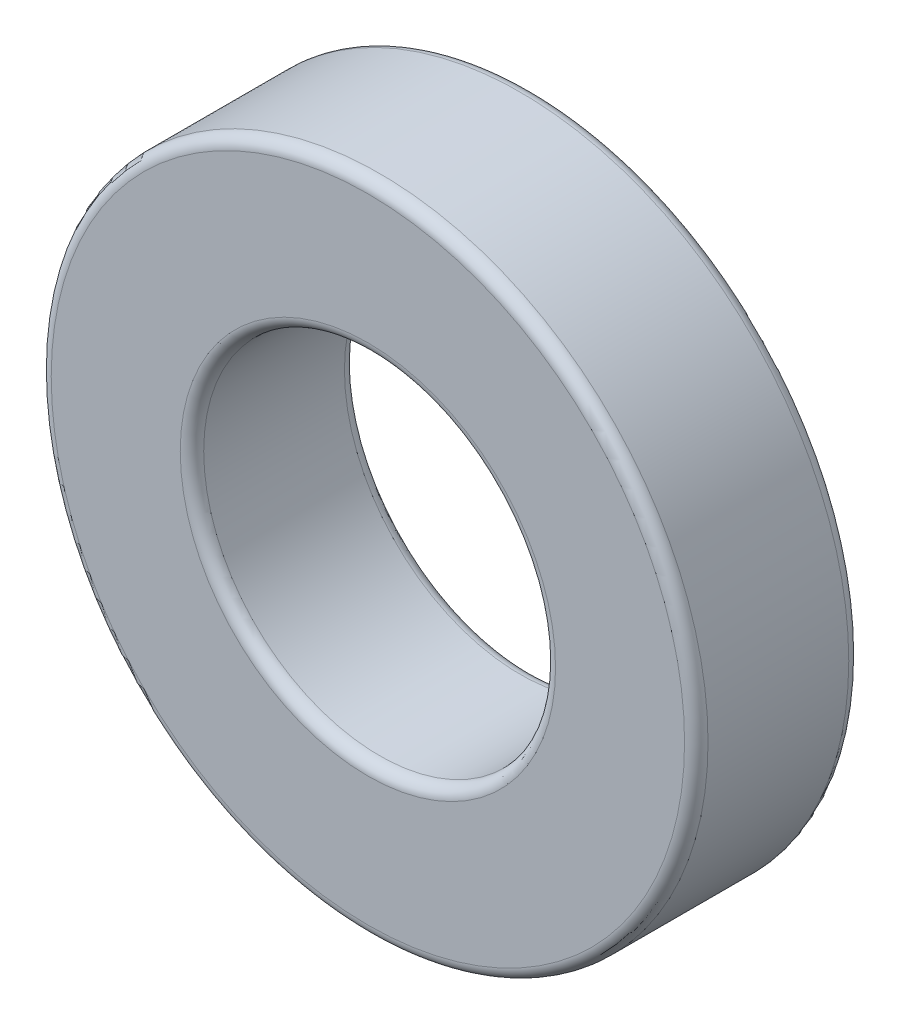
ISO-10303-21;
HEADER;
FILE_DESCRIPTION(('STEP AP214'),'2;1');
FILE_NAME('part.step','',(''),(''),'','','');
FILE_SCHEMA(('AUTOMOTIVE_DESIGN { 1 0 10303 214 1 1 1 1 }'));
ENDSEC;
DATA;
#1=APPLICATION_CONTEXT('core data for automotive mechanical design processes');
#2=APPLICATION_PROTOCOL_DEFINITION('international standard','automotive_design',2000,#1);
#3=PRODUCT_CONTEXT('',#1,'mechanical');
#4=PRODUCT('Part','Part','',(#3));
#5=PRODUCT_RELATED_PRODUCT_CATEGORY('part','',(#4));
#6=PRODUCT_DEFINITION_FORMATION('','',#4);
#7=PRODUCT_DEFINITION_CONTEXT('part definition',#1,'design');
#8=PRODUCT_DEFINITION('design','',#6,#7);
#9=PRODUCT_DEFINITION_SHAPE('','',#8);
#10=(LENGTH_UNIT() NAMED_UNIT(*) SI_UNIT(.MILLI.,.METRE.));
#11=(NAMED_UNIT(*) PLANE_ANGLE_UNIT() SI_UNIT($,.RADIAN.));
#12=(NAMED_UNIT(*) SI_UNIT($,.STERADIAN.) SOLID_ANGLE_UNIT());
#13=UNCERTAINTY_MEASURE_WITH_UNIT(LENGTH_MEASURE(1.E-05),#10,'distance_accuracy_value','');
#14=(GEOMETRIC_REPRESENTATION_CONTEXT(3) GLOBAL_UNCERTAINTY_ASSIGNED_CONTEXT((#13)) GLOBAL_UNIT_ASSIGNED_CONTEXT((#10,
#11,#12)) REPRESENTATION_CONTEXT('',''));
#15=CARTESIAN_POINT('',(0.,0.,0.));
#16=DIRECTION('',(0.,0.,1.));
#17=DIRECTION('',(1.,0.,0.));
#18=AXIS2_PLACEMENT_3D('',#15,#16,#17);
#19=CARTESIAN_POINT('',(0.,0.,7.));
#20=DIRECTION('',(0.,0.,1.));
#21=DIRECTION('',(1.,0.,0.));
#22=AXIS2_PLACEMENT_3D('',#19,#20,#21);
#23=PLANE('',#22);
#24=CARTESIAN_POINT('',(0.,0.,7.));
#25=DIRECTION('',(0.,0.,1.));
#26=DIRECTION('',(1.,0.,0.));
#27=AXIS2_PLACEMENT_3D('',#24,#25,#26);
#28=CIRCLE('',#27,13.5);
#29=CARTESIAN_POINT('',(13.5,0.,7.));
#30=VERTEX_POINT('',#29);
#31=EDGE_CURVE('E39',#30,#30,#28,.T.);
#32=ORIENTED_EDGE('',*,*,#31,.T.);
#33=EDGE_LOOP('',(#32));
#34=FACE_BOUND('',#33,.T.);
#35=CARTESIAN_POINT('',(0.,0.,7.));
#36=DIRECTION('',(0.,0.,1.));
#37=DIRECTION('',(1.,0.,0.));
#38=AXIS2_PLACEMENT_3D('',#35,#36,#37);
#39=CIRCLE('',#38,8.);
#40=CARTESIAN_POINT('',(8.,0.,7.));
#41=VERTEX_POINT('',#40);
#42=EDGE_CURVE('E43',#41,#41,#39,.F.);
#43=ORIENTED_EDGE('',*,*,#42,.T.);
#44=EDGE_LOOP('',(#43));
#45=FACE_BOUND('',#44,.T.);
#46=ADVANCED_FACE('F28',(#34,#45),#23,.T.);
#47=CARTESIAN_POINT('',(0.,0.,0.));
#48=DIRECTION('',(0.,0.,1.));
#49=DIRECTION('',(1.,0.,0.));
#50=AXIS2_PLACEMENT_3D('',#47,#48,#49);
#51=PLANE('',#50);
#52=CARTESIAN_POINT('',(0.,0.,0.));
#53=DIRECTION('',(0.,0.,1.));
#54=DIRECTION('',(1.,0.,0.));
#55=AXIS2_PLACEMENT_3D('',#52,#53,#54);
#56=CIRCLE('',#55,13.5);
#57=CARTESIAN_POINT('',(13.5,0.,0.));
#58=VERTEX_POINT('',#57);
#59=EDGE_CURVE('E48',#58,#58,#56,.F.);
#60=ORIENTED_EDGE('',*,*,#59,.T.);
#61=EDGE_LOOP('',(#60));
#62=FACE_BOUND('',#61,.T.);
#63=CARTESIAN_POINT('',(0.,0.,0.));
#64=DIRECTION('',(0.,0.,1.));
#65=DIRECTION('',(1.,0.,0.));
#66=AXIS2_PLACEMENT_3D('',#63,#64,#65);
#67=CIRCLE('',#66,8.);
#68=CARTESIAN_POINT('',(8.,0.,0.));
#69=VERTEX_POINT('',#68);
#70=EDGE_CURVE('E51',#69,#69,#67,.T.);
#71=ORIENTED_EDGE('',*,*,#70,.T.);
#72=EDGE_LOOP('',(#71));
#73=FACE_BOUND('',#72,.T.);
#74=ADVANCED_FACE('F73',(#62,#73),#51,.F.);
#75=CARTESIAN_POINT('',(0.,0.,7.));
#76=DIRECTION('',(0.,0.,-1.));
#77=DIRECTION('',(-1.,0.,0.));
#78=AXIS2_PLACEMENT_3D('',#75,#76,#77);
#79=CYLINDRICAL_SURFACE('',#78,14.);
#80=CARTESIAN_POINT('',(0.,0.,0.5));
#81=DIRECTION('',(0.,0.,1.));
#82=DIRECTION('',(1.,0.,0.));
#83=AXIS2_PLACEMENT_3D('',#80,#81,#82);
#84=CIRCLE('',#83,14.);
#85=CARTESIAN_POINT('',(14.,0.,0.5));
#86=VERTEX_POINT('',#85);
#87=EDGE_CURVE('E54',#86,#86,#84,.T.);
#88=ORIENTED_EDGE('',*,*,#87,.T.);
#89=EDGE_LOOP('',(#88));
#90=FACE_BOUND('',#89,.T.);
#91=CARTESIAN_POINT('',(0.,0.,6.5));
#92=DIRECTION('',(0.,0.,1.));
#93=DIRECTION('',(1.,0.,0.));
#94=AXIS2_PLACEMENT_3D('',#91,#92,#93);
#95=CIRCLE('',#94,14.);
#96=CARTESIAN_POINT('',(14.,0.,6.5));
#97=VERTEX_POINT('',#96);
#98=EDGE_CURVE('E57',#97,#97,#95,.F.);
#99=ORIENTED_EDGE('',*,*,#98,.T.);
#100=EDGE_LOOP('',(#99));
#101=FACE_BOUND('',#100,.T.);
#102=ADVANCED_FACE('F61',(#90,#101),#79,.T.);
#103=CARTESIAN_POINT('',(0.,0.,7.));
#104=DIRECTION('',(0.,0.,-1.));
#105=DIRECTION('',(-1.,0.,0.));
#106=AXIS2_PLACEMENT_3D('',#103,#104,#105);
#107=CYLINDRICAL_SURFACE('',#106,7.5);
#108=CARTESIAN_POINT('',(0.,0.,0.5));
#109=DIRECTION('',(0.,0.,1.));
#110=DIRECTION('',(1.,0.,0.));
#111=AXIS2_PLACEMENT_3D('',#108,#109,#110);
#112=CIRCLE('',#111,7.5);
#113=CARTESIAN_POINT('',(7.5,0.,0.5));
#114=VERTEX_POINT('',#113);
#115=EDGE_CURVE('E10',#114,#114,#112,.F.);
#116=ORIENTED_EDGE('',*,*,#115,.T.);
#117=EDGE_LOOP('',(#116));
#118=FACE_BOUND('',#117,.T.);
#119=CARTESIAN_POINT('',(0.,0.,6.5));
#120=DIRECTION('',(0.,0.,1.));
#121=DIRECTION('',(1.,0.,0.));
#122=AXIS2_PLACEMENT_3D('',#119,#120,#121);
#123=CIRCLE('',#122,7.5);
#124=CARTESIAN_POINT('',(7.5,0.,6.5));
#125=VERTEX_POINT('',#124);
#126=EDGE_CURVE('E35',#125,#125,#123,.T.);
#127=ORIENTED_EDGE('',*,*,#126,.T.);
#128=EDGE_LOOP('',(#127));
#129=FACE_BOUND('',#128,.T.);
#130=ADVANCED_FACE('F89',(#118,#129),#107,.F.);
#131=CARTESIAN_POINT('',(0.,0.,0.5));
#132=DIRECTION('',(0.,0.,1.));
#133=DIRECTION('',(1.,0.,0.));
#134=AXIS2_PLACEMENT_3D('',#131,#132,#133);
#135=TOROIDAL_SURFACE('',#134,13.5,0.5);
#136=ORIENTED_EDGE('',*,*,#59,.F.);
#137=EDGE_LOOP('',(#136));
#138=FACE_BOUND('',#137,.T.);
#139=ORIENTED_EDGE('',*,*,#87,.F.);
#140=EDGE_LOOP('',(#139));
#141=FACE_BOUND('',#140,.T.);
#142=ADVANCED_FACE('F67',(#138,#141),#135,.T.);
#143=CARTESIAN_POINT('',(0.,0.,6.5));
#144=DIRECTION('',(0.,0.,1.));
#145=DIRECTION('',(1.,0.,0.));
#146=AXIS2_PLACEMENT_3D('',#143,#144,#145);
#147=TOROIDAL_SURFACE('',#146,13.5,0.5);
#148=ORIENTED_EDGE('',*,*,#98,.F.);
#149=EDGE_LOOP('',(#148));
#150=FACE_BOUND('',#149,.T.);
#151=ORIENTED_EDGE('',*,*,#31,.F.);
#152=EDGE_LOOP('',(#151));
#153=FACE_BOUND('',#152,.T.);
#154=ADVANCED_FACE('F63',(#150,#153),#147,.T.);
#155=CARTESIAN_POINT('',(0.,0.,0.5));
#156=DIRECTION('',(0.,0.,1.));
#157=DIRECTION('',(1.,0.,0.));
#158=AXIS2_PLACEMENT_3D('',#155,#156,#157);
#159=TOROIDAL_SURFACE('',#158,8.,0.5);
#160=ORIENTED_EDGE('',*,*,#115,.F.);
#161=EDGE_LOOP('',(#160));
#162=FACE_BOUND('',#161,.T.);
#163=ORIENTED_EDGE('',*,*,#70,.F.);
#164=EDGE_LOOP('',(#163));
#165=FACE_BOUND('',#164,.T.);
#166=ADVANCED_FACE('F66',(#162,#165),#159,.T.);
#167=CARTESIAN_POINT('',(0.,0.,6.5));
#168=DIRECTION('',(0.,0.,1.));
#169=DIRECTION('',(1.,0.,0.));
#170=AXIS2_PLACEMENT_3D('',#167,#168,#169);
#171=TOROIDAL_SURFACE('',#170,8.,0.5);
#172=ORIENTED_EDGE('',*,*,#42,.F.);
#173=EDGE_LOOP('',(#172));
#174=FACE_BOUND('',#173,.T.);
#175=ORIENTED_EDGE('',*,*,#126,.F.);
#176=EDGE_LOOP('',(#175));
#177=FACE_BOUND('',#176,.T.);
#178=ADVANCED_FACE('F30',(#174,#177),#171,.T.);
#179=CLOSED_SHELL('',(#46,#74,#102,#130,#142,#154,#166,#178));
#180=MANIFOLD_SOLID_BREP('B2',#179);
#181=ADVANCED_BREP_SHAPE_REPRESENTATION('',(#18,#180),#14);
#182=SHAPE_DEFINITION_REPRESENTATION(#9,#181);
ENDSEC;
END-ISO-10303-21;
